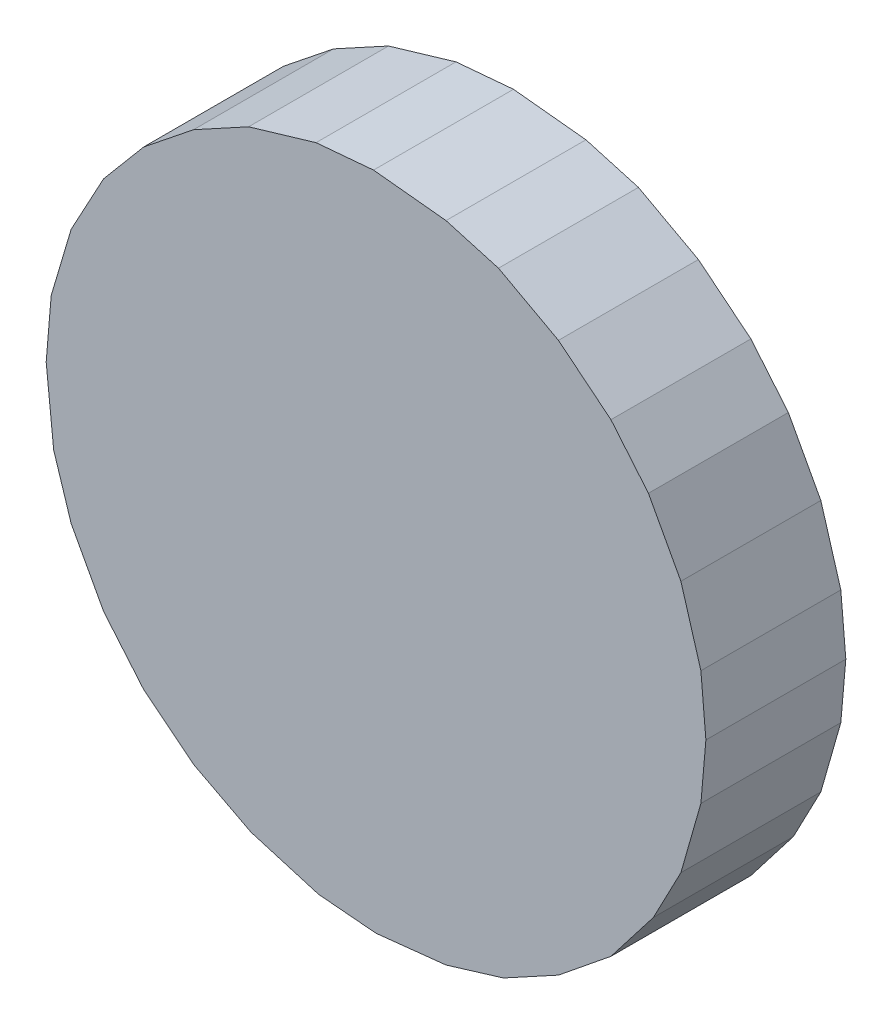
ISO-10303-21;
HEADER;
FILE_DESCRIPTION(('STEP AP214'),'2;1');
FILE_NAME('part.step','',(''),(''),'','','');
FILE_SCHEMA(('AUTOMOTIVE_DESIGN { 1 0 10303 214 1 1 1 1 }'));
ENDSEC;
DATA;
#1=APPLICATION_CONTEXT('core data for automotive mechanical design processes');
#2=APPLICATION_PROTOCOL_DEFINITION('international standard','automotive_design',2000,#1);
#3=PRODUCT_CONTEXT('',#1,'mechanical');
#4=PRODUCT('Part','Part','',(#3));
#5=PRODUCT_RELATED_PRODUCT_CATEGORY('part','',(#4));
#6=PRODUCT_DEFINITION_FORMATION('','',#4);
#7=PRODUCT_DEFINITION_CONTEXT('part definition',#1,'design');
#8=PRODUCT_DEFINITION('design','',#6,#7);
#9=PRODUCT_DEFINITION_SHAPE('','',#8);
#10=(LENGTH_UNIT() NAMED_UNIT(*) SI_UNIT(.MILLI.,.METRE.));
#11=(NAMED_UNIT(*) PLANE_ANGLE_UNIT() SI_UNIT($,.RADIAN.));
#12=(NAMED_UNIT(*) SI_UNIT($,.STERADIAN.) SOLID_ANGLE_UNIT());
#13=UNCERTAINTY_MEASURE_WITH_UNIT(LENGTH_MEASURE(1.E-05),#10,'distance_accuracy_value','');
#14=(GEOMETRIC_REPRESENTATION_CONTEXT(3) GLOBAL_UNCERTAINTY_ASSIGNED_CONTEXT((#13)) GLOBAL_UNIT_ASSIGNED_CONTEXT((#10,
#11,#12)) REPRESENTATION_CONTEXT('',''));
#15=CARTESIAN_POINT('',(0.,0.,0.));
#16=DIRECTION('',(0.,0.,1.));
#17=DIRECTION('',(1.,0.,0.));
#18=AXIS2_PLACEMENT_3D('',#15,#16,#17);
#19=CARTESIAN_POINT('',(-1.15,-6.499975,2.8));
#20=DIRECTION('',(0.0866296163648422,0.996240588195683,0.));
#21=DIRECTION('',(-0.996240588195683,0.0866296163648422,0.));
#22=AXIS2_PLACEMENT_3D('',#19,#20,#21);
#23=PLANE('',#22);
#24=DIRECTION('',(0.996240588195683,-0.0866296163648422,0.));
#25=VECTOR('',#24,1.);
#26=CARTESIAN_POINT('',(-1.15,-6.499975,0.));
#27=LINE('',#26,#25);
#28=CARTESIAN_POINT('',(-1.15,-6.499975,0.));
#29=VERTEX_POINT('',#28);
#30=CARTESIAN_POINT('',(0.,-6.599975,0.));
#31=VERTEX_POINT('',#30);
#32=EDGE_CURVE('E274',#29,#31,#27,.T.);
#33=ORIENTED_EDGE('',*,*,#32,.T.);
#34=DIRECTION('',(0.,0.,-1.));
#35=VECTOR('',#34,1.);
#36=CARTESIAN_POINT('',(0.,-6.599975,2.8));
#37=LINE('',#36,#35);
#38=CARTESIAN_POINT('',(0.,-6.599975,2.8));
#39=VERTEX_POINT('',#38);
#40=EDGE_CURVE('E11',#39,#31,#37,.T.);
#41=ORIENTED_EDGE('',*,*,#40,.F.);
#42=DIRECTION('',(0.996240588195683,-0.0866296163648422,0.));
#43=VECTOR('',#42,1.);
#44=CARTESIAN_POINT('',(-1.15,-6.499975,2.8));
#45=LINE('',#44,#43);
#46=CARTESIAN_POINT('',(-1.15,-6.499975,2.8));
#47=VERTEX_POINT('',#46);
#48=EDGE_CURVE('E336',#47,#39,#45,.T.);
#49=ORIENTED_EDGE('',*,*,#48,.F.);
#50=DIRECTION('',(0.,0.,-1.));
#51=VECTOR('',#50,1.);
#52=CARTESIAN_POINT('',(-1.15,-6.499975,2.8));
#53=LINE('',#52,#51);
#54=EDGE_CURVE('E270',#47,#29,#53,.T.);
#55=ORIENTED_EDGE('',*,*,#54,.T.);
#56=EDGE_LOOP('',(#33,#41,#49,#55));
#57=FACE_BOUND('',#56,.T.);
#58=ADVANCED_FACE('F34',(#57),#23,.F.);
#59=CARTESIAN_POINT('',(0.,-6.599975,2.8));
#60=DIRECTION('',(-0.106533123634265,0.994309153919809,0.));
#61=DIRECTION('',(-0.994309153919809,-0.106533123634265,0.));
#62=AXIS2_PLACEMENT_3D('',#59,#60,#61);
#63=PLANE('',#62);
#64=DIRECTION('',(0.994309153919809,0.106533123634265,0.));
#65=VECTOR('',#64,1.);
#66=CARTESIAN_POINT('',(0.,-6.599975,0.));
#67=LINE('',#66,#65);
#68=CARTESIAN_POINT('',(1.4,-6.449975,0.));
#69=VERTEX_POINT('',#68);
#70=EDGE_CURVE('E277',#31,#69,#67,.T.);
#71=ORIENTED_EDGE('',*,*,#70,.T.);
#72=DIRECTION('',(0.,0.,-1.));
#73=VECTOR('',#72,1.);
#74=CARTESIAN_POINT('',(1.4,-6.449975,2.8));
#75=LINE('',#74,#73);
#76=CARTESIAN_POINT('',(1.4,-6.449975,2.8));
#77=VERTEX_POINT('',#76);
#78=EDGE_CURVE('E42',#77,#69,#75,.T.);
#79=ORIENTED_EDGE('',*,*,#78,.F.);
#80=DIRECTION('',(0.994309153919809,0.106533123634265,0.));
#81=VECTOR('',#80,1.);
#82=CARTESIAN_POINT('',(0.,-6.599975,2.8));
#83=LINE('',#82,#81);
#84=EDGE_CURVE('E165',#39,#77,#83,.T.);
#85=ORIENTED_EDGE('',*,*,#84,.F.);
#86=ORIENTED_EDGE('',*,*,#40,.T.);
#87=EDGE_LOOP('',(#71,#79,#85,#86));
#88=FACE_BOUND('',#87,.T.);
#89=ADVANCED_FACE('F514',(#88),#63,.F.);
#90=CARTESIAN_POINT('',(1.4,-6.449975,2.8));
#91=DIRECTION('',(-0.291161615782697,0.956673880428858,0.));
#92=DIRECTION('',(-0.956673880428858,-0.291161615782697,0.));
#93=AXIS2_PLACEMENT_3D('',#90,#91,#92);
#94=PLANE('',#93);
#95=DIRECTION('',(0.956673880428858,0.291161615782696,0.));
#96=VECTOR('',#95,1.);
#97=CARTESIAN_POINT('',(1.4,-6.449975,0.));
#98=LINE('',#97,#96);
#99=CARTESIAN_POINT('',(2.55,-6.099975,0.));
#100=VERTEX_POINT('',#99);
#101=EDGE_CURVE('E279',#69,#100,#98,.T.);
#102=ORIENTED_EDGE('',*,*,#101,.T.);
#103=DIRECTION('',(0.,0.,-1.));
#104=VECTOR('',#103,1.);
#105=CARTESIAN_POINT('',(2.55,-6.099975,2.8));
#106=LINE('',#105,#104);
#107=CARTESIAN_POINT('',(2.55,-6.099975,2.8));
#108=VERTEX_POINT('',#107);
#109=EDGE_CURVE('E415',#108,#100,#106,.T.);
#110=ORIENTED_EDGE('',*,*,#109,.F.);
#111=DIRECTION('',(0.956673880428858,0.291161615782696,0.));
#112=VECTOR('',#111,1.);
#113=CARTESIAN_POINT('',(1.4,-6.449975,2.8));
#114=LINE('',#113,#112);
#115=EDGE_CURVE('E423',#77,#108,#114,.T.);
#116=ORIENTED_EDGE('',*,*,#115,.F.);
#117=ORIENTED_EDGE('',*,*,#78,.T.);
#118=EDGE_LOOP('',(#102,#110,#116,#117));
#119=FACE_BOUND('',#118,.T.);
#120=ADVANCED_FACE('F421',(#119),#94,.F.);
#121=CARTESIAN_POINT('',(2.55,-6.099975,2.8));
#122=DIRECTION('',(-0.478852130680573,0.877895572914385,0.));
#123=DIRECTION('',(-0.877895572914385,-0.478852130680573,0.));
#124=AXIS2_PLACEMENT_3D('',#121,#122,#123);
#125=PLANE('',#124);
#126=DIRECTION('',(0.877895572914384,0.478852130680573,0.));
#127=VECTOR('',#126,1.);
#128=CARTESIAN_POINT('',(2.55,-6.099975,0.));
#129=LINE('',#128,#127);
#130=CARTESIAN_POINT('',(3.65,-5.499975,0.));
#131=VERTEX_POINT('',#130);
#132=EDGE_CURVE('E281',#100,#131,#129,.T.);
#133=ORIENTED_EDGE('',*,*,#132,.T.);
#134=DIRECTION('',(0.,0.,-1.));
#135=VECTOR('',#134,1.);
#136=CARTESIAN_POINT('',(3.65,-5.499975,2.8));
#137=LINE('',#136,#135);
#138=CARTESIAN_POINT('',(3.65,-5.499975,2.8));
#139=VERTEX_POINT('',#138);
#140=EDGE_CURVE('E412',#139,#131,#137,.T.);
#141=ORIENTED_EDGE('',*,*,#140,.F.);
#142=DIRECTION('',(0.877895572914384,0.478852130680573,0.));
#143=VECTOR('',#142,1.);
#144=CARTESIAN_POINT('',(2.55,-6.099975,2.8));
#145=LINE('',#144,#143);
#146=EDGE_CURVE('E441',#108,#139,#145,.T.);
#147=ORIENTED_EDGE('',*,*,#146,.F.);
#148=ORIENTED_EDGE('',*,*,#109,.T.);
#149=EDGE_LOOP('',(#133,#141,#147,#148));
#150=FACE_BOUND('',#149,.T.);
#151=ADVANCED_FACE('F432',(#150),#125,.F.);
#152=CARTESIAN_POINT('',(3.65,-5.499975,2.8));
#153=DIRECTION('',(-0.629198228667964,0.777244870707486,0.));
#154=DIRECTION('',(-0.777244870707486,-0.629198228667964,0.));
#155=AXIS2_PLACEMENT_3D('',#152,#153,#154);
#156=PLANE('',#155);
#157=DIRECTION('',(0.777244870707486,0.629198228667964,0.));
#158=VECTOR('',#157,1.);
#159=CARTESIAN_POINT('',(3.65,-5.499975,0.));
#160=LINE('',#159,#158);
#161=CARTESIAN_POINT('',(4.7,-4.649975,0.));
#162=VERTEX_POINT('',#161);
#163=EDGE_CURVE('E283',#131,#162,#160,.T.);
#164=ORIENTED_EDGE('',*,*,#163,.T.);
#165=DIRECTION('',(0.,0.,-1.));
#166=VECTOR('',#165,1.);
#167=CARTESIAN_POINT('',(4.7,-4.649975,2.8));
#168=LINE('',#167,#166);
#169=CARTESIAN_POINT('',(4.7,-4.649975,2.8));
#170=VERTEX_POINT('',#169);
#171=EDGE_CURVE('E409',#170,#162,#168,.T.);
#172=ORIENTED_EDGE('',*,*,#171,.F.);
#173=DIRECTION('',(0.777244870707486,0.629198228667964,0.));
#174=VECTOR('',#173,1.);
#175=CARTESIAN_POINT('',(3.65,-5.499975,2.8));
#176=LINE('',#175,#174);
#177=EDGE_CURVE('E438',#139,#170,#176,.T.);
#178=ORIENTED_EDGE('',*,*,#177,.F.);
#179=ORIENTED_EDGE('',*,*,#140,.T.);
#180=EDGE_LOOP('',(#164,#172,#178,#179));
#181=FACE_BOUND('',#180,.T.);
#182=ADVANCED_FACE('F436',(#181),#156,.F.);
#183=CARTESIAN_POINT('',(4.7,-4.649975,2.8));
#184=DIRECTION('',(-0.791285001392167,0.611447501075765,0.));
#185=DIRECTION('',(-0.611447501075765,-0.791285001392167,0.));
#186=AXIS2_PLACEMENT_3D('',#183,#184,#185);
#187=PLANE('',#186);
#188=DIRECTION('',(0.611447501075765,0.791285001392167,0.));
#189=VECTOR('',#188,1.);
#190=CARTESIAN_POINT('',(4.7,-4.649975,0.));
#191=LINE('',#190,#189);
#192=CARTESIAN_POINT('',(5.55,-3.549975,0.));
#193=VERTEX_POINT('',#192);
#194=EDGE_CURVE('E285',#162,#193,#191,.T.);
#195=ORIENTED_EDGE('',*,*,#194,.T.);
#196=DIRECTION('',(0.,0.,-1.));
#197=VECTOR('',#196,1.);
#198=CARTESIAN_POINT('',(5.55,-3.549975,2.8));
#199=LINE('',#198,#197);
#200=CARTESIAN_POINT('',(5.55,-3.549975,2.8));
#201=VERTEX_POINT('',#200);
#202=EDGE_CURVE('E406',#201,#193,#199,.T.);
#203=ORIENTED_EDGE('',*,*,#202,.F.);
#204=DIRECTION('',(0.611447501075765,0.791285001392167,0.));
#205=VECTOR('',#204,1.);
#206=CARTESIAN_POINT('',(4.7,-4.649975,2.8));
#207=LINE('',#206,#205);
#208=EDGE_CURVE('E440',#170,#201,#207,.T.);
#209=ORIENTED_EDGE('',*,*,#208,.F.);
#210=ORIENTED_EDGE('',*,*,#171,.T.);
#211=EDGE_LOOP('',(#195,#203,#209,#210));
#212=FACE_BOUND('',#211,.T.);
#213=ADVANCED_FACE('F527',(#212),#187,.F.);
#214=CARTESIAN_POINT('',(5.55,-3.549975,2.8));
#215=DIRECTION('',(-0.885831535280156,0.464006994670557,0.));
#216=DIRECTION('',(-0.464006994670557,-0.885831535280156,0.));
#217=AXIS2_PLACEMENT_3D('',#214,#215,#216);
#218=PLANE('',#217);
#219=DIRECTION('',(0.464006994670557,0.885831535280156,0.));
#220=VECTOR('',#219,1.);
#221=CARTESIAN_POINT('',(5.55,-3.549975,0.));
#222=LINE('',#221,#220);
#223=CARTESIAN_POINT('',(6.1,-2.499975,0.));
#224=VERTEX_POINT('',#223);
#225=EDGE_CURVE('E287',#193,#224,#222,.T.);
#226=ORIENTED_EDGE('',*,*,#225,.T.);
#227=DIRECTION('',(0.,0.,-1.));
#228=VECTOR('',#227,1.);
#229=CARTESIAN_POINT('',(6.1,-2.499975,2.8));
#230=LINE('',#229,#228);
#231=CARTESIAN_POINT('',(6.1,-2.499975,2.8));
#232=VERTEX_POINT('',#231);
#233=EDGE_CURVE('E403',#232,#224,#230,.T.);
#234=ORIENTED_EDGE('',*,*,#233,.F.);
#235=DIRECTION('',(0.464006994670557,0.885831535280156,0.));
#236=VECTOR('',#235,1.);
#237=CARTESIAN_POINT('',(5.55,-3.549975,2.8));
#238=LINE('',#237,#236);
#239=EDGE_CURVE('E443',#201,#232,#238,.T.);
#240=ORIENTED_EDGE('',*,*,#239,.F.);
#241=ORIENTED_EDGE('',*,*,#202,.T.);
#242=EDGE_LOOP('',(#226,#234,#240,#241));
#243=FACE_BOUND('',#242,.T.);
#244=ADVANCED_FACE('F530',(#243),#218,.F.);
#245=CARTESIAN_POINT('',(6.1,-2.499975,2.8));
#246=DIRECTION('',(-0.961523947640823,0.274721127897378,0.));
#247=DIRECTION('',(-0.274721127897378,-0.961523947640823,0.));
#248=AXIS2_PLACEMENT_3D('',#245,#246,#247);
#249=PLANE('',#248);
#250=DIRECTION('',(0.274721127897378,0.961523947640823,0.));
#251=VECTOR('',#250,1.);
#252=CARTESIAN_POINT('',(6.1,-2.499975,0.));
#253=LINE('',#252,#251);
#254=CARTESIAN_POINT('',(6.5,-1.099975,0.));
#255=VERTEX_POINT('',#254);
#256=EDGE_CURVE('E289',#224,#255,#253,.T.);
#257=ORIENTED_EDGE('',*,*,#256,.T.);
#258=DIRECTION('',(0.,0.,-1.));
#259=VECTOR('',#258,1.);
#260=CARTESIAN_POINT('',(6.5,-1.099975,2.8));
#261=LINE('',#260,#259);
#262=CARTESIAN_POINT('',(6.5,-1.099975,2.8));
#263=VERTEX_POINT('',#262);
#264=EDGE_CURVE('E400',#263,#255,#261,.T.);
#265=ORIENTED_EDGE('',*,*,#264,.F.);
#266=DIRECTION('',(0.274721127897378,0.961523947640823,0.));
#267=VECTOR('',#266,1.);
#268=CARTESIAN_POINT('',(6.1,-2.499975,2.8));
#269=LINE('',#268,#267);
#270=EDGE_CURVE('E449',#232,#263,#269,.T.);
#271=ORIENTED_EDGE('',*,*,#270,.F.);
#272=ORIENTED_EDGE('',*,*,#233,.T.);
#273=EDGE_LOOP('',(#257,#265,#271,#272));
#274=FACE_BOUND('',#273,.T.);
#275=ADVANCED_FACE('F534',(#274),#249,.F.);
#276=CARTESIAN_POINT('',(6.5,-1.099975,2.8));
#277=DIRECTION('',(-0.996240588195683,0.0866296163648422,0.));
#278=DIRECTION('',(-0.0866296163648422,-0.996240588195683,0.));
#279=AXIS2_PLACEMENT_3D('',#276,#277,#278);
#280=PLANE('',#279);
#281=DIRECTION('',(0.0866296163648422,0.996240588195683,0.));
#282=VECTOR('',#281,1.);
#283=CARTESIAN_POINT('',(6.5,-1.099975,0.));
#284=LINE('',#283,#282);
#285=CARTESIAN_POINT('',(6.6,0.050025,0.));
#286=VERTEX_POINT('',#285);
#287=EDGE_CURVE('E291',#255,#286,#284,.T.);
#288=ORIENTED_EDGE('',*,*,#287,.T.);
#289=DIRECTION('',(0.,0.,-1.));
#290=VECTOR('',#289,1.);
#291=CARTESIAN_POINT('',(6.6,0.050025,2.8));
#292=LINE('',#291,#290);
#293=CARTESIAN_POINT('',(6.6,0.050025,2.8));
#294=VERTEX_POINT('',#293);
#295=EDGE_CURVE('E397',#294,#286,#292,.T.);
#296=ORIENTED_EDGE('',*,*,#295,.F.);
#297=DIRECTION('',(0.0866296163648422,0.996240588195683,0.));
#298=VECTOR('',#297,1.);
#299=CARTESIAN_POINT('',(6.5,-1.099975,2.8));
#300=LINE('',#299,#298);
#301=EDGE_CURVE('E451',#263,#294,#300,.T.);
#302=ORIENTED_EDGE('',*,*,#301,.F.);
#303=ORIENTED_EDGE('',*,*,#264,.T.);
#304=EDGE_LOOP('',(#288,#296,#302,#303));
#305=FACE_BOUND('',#304,.T.);
#306=ADVANCED_FACE('F538',(#305),#280,.F.);
#307=CARTESIAN_POINT('',(6.6,0.050025,2.8));
#308=DIRECTION('',(-0.996240588195683,-0.0866296163648422,0.));
#309=DIRECTION('',(0.0866296163648422,-0.996240588195683,0.));
#310=AXIS2_PLACEMENT_3D('',#307,#308,#309);
#311=PLANE('',#310);
#312=DIRECTION('',(-0.0866296163648422,0.996240588195683,0.));
#313=VECTOR('',#312,1.);
#314=CARTESIAN_POINT('',(6.6,0.050025,0.));
#315=LINE('',#314,#313);
#316=CARTESIAN_POINT('',(6.5,1.200025,0.));
#317=VERTEX_POINT('',#316);
#318=EDGE_CURVE('E293',#286,#317,#315,.T.);
#319=ORIENTED_EDGE('',*,*,#318,.T.);
#320=DIRECTION('',(0.,0.,-1.));
#321=VECTOR('',#320,1.);
#322=CARTESIAN_POINT('',(6.5,1.200025,2.8));
#323=LINE('',#322,#321);
#324=CARTESIAN_POINT('',(6.5,1.200025,2.8));
#325=VERTEX_POINT('',#324);
#326=EDGE_CURVE('E394',#325,#317,#323,.T.);
#327=ORIENTED_EDGE('',*,*,#326,.F.);
#328=DIRECTION('',(-0.0866296163648422,0.996240588195683,0.));
#329=VECTOR('',#328,1.);
#330=CARTESIAN_POINT('',(6.6,0.050025,2.8));
#331=LINE('',#330,#329);
#332=EDGE_CURVE('E453',#294,#325,#331,.T.);
#333=ORIENTED_EDGE('',*,*,#332,.F.);
#334=ORIENTED_EDGE('',*,*,#295,.T.);
#335=EDGE_LOOP('',(#319,#327,#333,#334));
#336=FACE_BOUND('',#335,.T.);
#337=ADVANCED_FACE('F542',(#336),#311,.F.);
#338=CARTESIAN_POINT('',(6.5,1.200025,2.8));
#339=DIRECTION('',(-0.958798112708387,-0.284088329691374,0.));
#340=DIRECTION('',(0.284088329691374,-0.958798112708387,0.));
#341=AXIS2_PLACEMENT_3D('',#338,#339,#340);
#342=PLANE('',#341);
#343=DIRECTION('',(-0.284088329691374,0.958798112708387,0.));
#344=VECTOR('',#343,1.);
#345=CARTESIAN_POINT('',(6.5,1.200025,0.));
#346=LINE('',#345,#344);
#347=CARTESIAN_POINT('',(6.1,2.550025,0.));
#348=VERTEX_POINT('',#347);
#349=EDGE_CURVE('E295',#317,#348,#346,.T.);
#350=ORIENTED_EDGE('',*,*,#349,.T.);
#351=DIRECTION('',(0.,0.,-1.));
#352=VECTOR('',#351,1.);
#353=CARTESIAN_POINT('',(6.1,2.550025,2.8));
#354=LINE('',#353,#352);
#355=CARTESIAN_POINT('',(6.1,2.550025,2.8));
#356=VERTEX_POINT('',#355);
#357=EDGE_CURVE('E391',#356,#348,#354,.T.);
#358=ORIENTED_EDGE('',*,*,#357,.F.);
#359=DIRECTION('',(-0.284088329691374,0.958798112708387,0.));
#360=VECTOR('',#359,1.);
#361=CARTESIAN_POINT('',(6.5,1.200025,2.8));
#362=LINE('',#361,#360);
#363=EDGE_CURVE('E455',#325,#356,#362,.T.);
#364=ORIENTED_EDGE('',*,*,#363,.F.);
#365=ORIENTED_EDGE('',*,*,#326,.T.);
#366=EDGE_LOOP('',(#350,#358,#364,#365));
#367=FACE_BOUND('',#366,.T.);
#368=ADVANCED_FACE('F546',(#367),#342,.F.);
#369=CARTESIAN_POINT('',(6.1,2.550025,2.8));
#370=DIRECTION('',(-0.879291966536774,-0.476283148540752,0.));
#371=DIRECTION('',(0.476283148540752,-0.879291966536774,0.));
#372=AXIS2_PLACEMENT_3D('',#369,#370,#371);
#373=PLANE('',#372);
#374=DIRECTION('',(-0.476283148540752,0.879291966536774,0.));
#375=VECTOR('',#374,1.);
#376=CARTESIAN_POINT('',(6.1,2.550025,0.));
#377=LINE('',#376,#375);
#378=CARTESIAN_POINT('',(5.45,3.750025,0.));
#379=VERTEX_POINT('',#378);
#380=EDGE_CURVE('E297',#348,#379,#377,.T.);
#381=ORIENTED_EDGE('',*,*,#380,.T.);
#382=DIRECTION('',(0.,0.,-1.));
#383=VECTOR('',#382,1.);
#384=CARTESIAN_POINT('',(5.45,3.750025,2.8));
#385=LINE('',#384,#383);
#386=CARTESIAN_POINT('',(5.45,3.750025,2.8));
#387=VERTEX_POINT('',#386);
#388=EDGE_CURVE('E388',#387,#379,#385,.T.);
#389=ORIENTED_EDGE('',*,*,#388,.F.);
#390=DIRECTION('',(-0.476283148540752,0.879291966536774,0.));
#391=VECTOR('',#390,1.);
#392=CARTESIAN_POINT('',(6.1,2.550025,2.8));
#393=LINE('',#392,#391);
#394=EDGE_CURVE('E457',#356,#387,#393,.T.);
#395=ORIENTED_EDGE('',*,*,#394,.F.);
#396=ORIENTED_EDGE('',*,*,#357,.T.);
#397=EDGE_LOOP('',(#381,#389,#395,#396));
#398=FACE_BOUND('',#397,.T.);
#399=ADVANCED_FACE('F550',(#398),#373,.F.);
#400=CARTESIAN_POINT('',(5.45,3.750025,2.8));
#401=DIRECTION('',(-0.768221279597376,-0.64018439966448,0.));
#402=DIRECTION('',(0.64018439966448,-0.768221279597376,0.));
#403=AXIS2_PLACEMENT_3D('',#400,#401,#402);
#404=PLANE('',#403);
#405=DIRECTION('',(-0.64018439966448,0.768221279597376,0.));
#406=VECTOR('',#405,1.);
#407=CARTESIAN_POINT('',(5.45,3.750025,0.));
#408=LINE('',#407,#406);
#409=CARTESIAN_POINT('',(4.7,4.650025,0.));
#410=VERTEX_POINT('',#409);
#411=EDGE_CURVE('E299',#379,#410,#408,.T.);
#412=ORIENTED_EDGE('',*,*,#411,.T.);
#413=DIRECTION('',(0.,0.,-1.));
#414=VECTOR('',#413,1.);
#415=CARTESIAN_POINT('',(4.7,4.650025,2.8));
#416=LINE('',#415,#414);
#417=CARTESIAN_POINT('',(4.7,4.650025,2.8));
#418=VERTEX_POINT('',#417);
#419=EDGE_CURVE('E385',#418,#410,#416,.T.);
#420=ORIENTED_EDGE('',*,*,#419,.F.);
#421=DIRECTION('',(-0.64018439966448,0.768221279597376,0.));
#422=VECTOR('',#421,1.);
#423=CARTESIAN_POINT('',(5.45,3.750025,2.8));
#424=LINE('',#423,#422);
#425=EDGE_CURVE('E459',#387,#418,#424,.T.);
#426=ORIENTED_EDGE('',*,*,#425,.F.);
#427=ORIENTED_EDGE('',*,*,#388,.T.);
#428=EDGE_LOOP('',(#412,#420,#426,#427));
#429=FACE_BOUND('',#428,.T.);
#430=ADVANCED_FACE('F554',(#429),#404,.F.);
#431=CARTESIAN_POINT('',(4.7,4.650025,2.8));
#432=DIRECTION('',(-0.629198228667964,-0.777244870707486,0.));
#433=DIRECTION('',(0.777244870707486,-0.629198228667964,0.));
#434=AXIS2_PLACEMENT_3D('',#431,#432,#433);
#435=PLANE('',#434);
#436=DIRECTION('',(-0.777244870707486,0.629198228667964,0.));
#437=VECTOR('',#436,1.);
#438=CARTESIAN_POINT('',(4.7,4.650025,0.));
#439=LINE('',#438,#437);
#440=CARTESIAN_POINT('',(3.65,5.500025,0.));
#441=VERTEX_POINT('',#440);
#442=EDGE_CURVE('E301',#410,#441,#439,.T.);
#443=ORIENTED_EDGE('',*,*,#442,.T.);
#444=DIRECTION('',(0.,0.,-1.));
#445=VECTOR('',#444,1.);
#446=CARTESIAN_POINT('',(3.65,5.500025,2.8));
#447=LINE('',#446,#445);
#448=CARTESIAN_POINT('',(3.65,5.500025,2.8));
#449=VERTEX_POINT('',#448);
#450=EDGE_CURVE('E382',#449,#441,#447,.T.);
#451=ORIENTED_EDGE('',*,*,#450,.F.);
#452=DIRECTION('',(-0.777244870707486,0.629198228667964,0.));
#453=VECTOR('',#452,1.);
#454=CARTESIAN_POINT('',(4.7,4.650025,2.8));
#455=LINE('',#454,#453);
#456=EDGE_CURVE('E461',#418,#449,#455,.T.);
#457=ORIENTED_EDGE('',*,*,#456,.F.);
#458=ORIENTED_EDGE('',*,*,#419,.T.);
#459=EDGE_LOOP('',(#443,#451,#457,#458));
#460=FACE_BOUND('',#459,.T.);
#461=ADVANCED_FACE('F558',(#460),#435,.F.);
#462=CARTESIAN_POINT('',(3.65,5.500025,2.8));
#463=DIRECTION('',(-0.476283148540753,-0.879291966536774,0.));
#464=DIRECTION('',(0.879291966536774,-0.476283148540753,0.));
#465=AXIS2_PLACEMENT_3D('',#462,#463,#464);
#466=PLANE('',#465);
#467=DIRECTION('',(-0.879291966536774,0.476283148540753,0.));
#468=VECTOR('',#467,1.);
#469=CARTESIAN_POINT('',(3.65,5.500025,0.));
#470=LINE('',#469,#468);
#471=CARTESIAN_POINT('',(2.45,6.150025,0.));
#472=VERTEX_POINT('',#471);
#473=EDGE_CURVE('E303',#441,#472,#470,.T.);
#474=ORIENTED_EDGE('',*,*,#473,.T.);
#475=DIRECTION('',(0.,0.,-1.));
#476=VECTOR('',#475,1.);
#477=CARTESIAN_POINT('',(2.45,6.150025,2.8));
#478=LINE('',#477,#476);
#479=CARTESIAN_POINT('',(2.45,6.150025,2.8));
#480=VERTEX_POINT('',#479);
#481=EDGE_CURVE('E379',#480,#472,#478,.T.);
#482=ORIENTED_EDGE('',*,*,#481,.F.);
#483=DIRECTION('',(-0.879291966536774,0.476283148540753,0.));
#484=VECTOR('',#483,1.);
#485=CARTESIAN_POINT('',(3.65,5.500025,2.8));
#486=LINE('',#485,#484);
#487=EDGE_CURVE('E463',#449,#480,#486,.T.);
#488=ORIENTED_EDGE('',*,*,#487,.F.);
#489=ORIENTED_EDGE('',*,*,#450,.T.);
#490=EDGE_LOOP('',(#474,#482,#488,#489));
#491=FACE_BOUND('',#490,.T.);
#492=ADVANCED_FACE('F562',(#491),#466,.F.);
#493=CARTESIAN_POINT('',(2.45,6.150025,2.8));
#494=DIRECTION('',(-0.274721127897378,-0.961523947640823,0.));
#495=DIRECTION('',(0.961523947640823,-0.274721127897378,0.));
#496=AXIS2_PLACEMENT_3D('',#493,#494,#495);
#497=PLANE('',#496);
#498=DIRECTION('',(-0.961523947640823,0.274721127897378,0.));
#499=VECTOR('',#498,1.);
#500=CARTESIAN_POINT('',(2.45,6.150025,0.));
#501=LINE('',#500,#499);
#502=CARTESIAN_POINT('',(1.4,6.450025,0.));
#503=VERTEX_POINT('',#502);
#504=EDGE_CURVE('E305',#472,#503,#501,.T.);
#505=ORIENTED_EDGE('',*,*,#504,.T.);
#506=DIRECTION('',(0.,0.,-1.));
#507=VECTOR('',#506,1.);
#508=CARTESIAN_POINT('',(1.4,6.450025,2.8));
#509=LINE('',#508,#507);
#510=CARTESIAN_POINT('',(1.4,6.450025,2.8));
#511=VERTEX_POINT('',#510);
#512=EDGE_CURVE('E376',#511,#503,#509,.T.);
#513=ORIENTED_EDGE('',*,*,#512,.F.);
#514=DIRECTION('',(-0.961523947640823,0.274721127897378,0.));
#515=VECTOR('',#514,1.);
#516=CARTESIAN_POINT('',(2.45,6.150025,2.8));
#517=LINE('',#516,#515);
#518=EDGE_CURVE('E465',#480,#511,#517,.T.);
#519=ORIENTED_EDGE('',*,*,#518,.F.);
#520=ORIENTED_EDGE('',*,*,#481,.T.);
#521=EDGE_LOOP('',(#505,#513,#519,#520));
#522=FACE_BOUND('',#521,.T.);
#523=ADVANCED_FACE('F566',(#522),#497,.F.);
#524=CARTESIAN_POINT('',(1.4,6.450025,2.8));
#525=DIRECTION('',(-0.102899151085505,-0.994691793826551,0.));
#526=DIRECTION('',(0.994691793826551,-0.102899151085505,0.));
#527=AXIS2_PLACEMENT_3D('',#524,#525,#526);
#528=PLANE('',#527);
#529=DIRECTION('',(-0.994691793826551,0.102899151085505,0.));
#530=VECTOR('',#529,1.);
#531=CARTESIAN_POINT('',(1.4,6.450025,0.));
#532=LINE('',#531,#530);
#533=CARTESIAN_POINT('',(-0.05,6.600025,0.));
#534=VERTEX_POINT('',#533);
#535=EDGE_CURVE('E307',#503,#534,#532,.T.);
#536=ORIENTED_EDGE('',*,*,#535,.T.);
#537=DIRECTION('',(0.,0.,-1.));
#538=VECTOR('',#537,1.);
#539=CARTESIAN_POINT('',(-0.05,6.600025,2.8));
#540=LINE('',#539,#538);
#541=CARTESIAN_POINT('',(-0.05,6.600025,2.8));
#542=VERTEX_POINT('',#541);
#543=EDGE_CURVE('E373',#542,#534,#540,.T.);
#544=ORIENTED_EDGE('',*,*,#543,.F.);
#545=DIRECTION('',(-0.994691793826551,0.102899151085505,0.));
#546=VECTOR('',#545,1.);
#547=CARTESIAN_POINT('',(1.4,6.450025,2.8));
#548=LINE('',#547,#546);
#549=EDGE_CURVE('E467',#511,#542,#548,.T.);
#550=ORIENTED_EDGE('',*,*,#549,.F.);
#551=ORIENTED_EDGE('',*,*,#512,.T.);
#552=EDGE_LOOP('',(#536,#544,#550,#551));
#553=FACE_BOUND('',#552,.T.);
#554=ADVANCED_FACE('F570',(#553),#528,.F.);
#555=CARTESIAN_POINT('',(-0.05,6.600025,2.8));
#556=DIRECTION('',(0.0866296163648422,-0.996240588195683,0.));
#557=DIRECTION('',(0.996240588195683,0.0866296163648422,0.));
#558=AXIS2_PLACEMENT_3D('',#555,#556,#557);
#559=PLANE('',#558);
#560=DIRECTION('',(-0.996240588195683,-0.0866296163648422,0.));
#561=VECTOR('',#560,1.);
#562=CARTESIAN_POINT('',(-0.05,6.600025,0.));
#563=LINE('',#562,#561);
#564=CARTESIAN_POINT('',(-1.2,6.500025,0.));
#565=VERTEX_POINT('',#564);
#566=EDGE_CURVE('E309',#534,#565,#563,.T.);
#567=ORIENTED_EDGE('',*,*,#566,.T.);
#568=DIRECTION('',(0.,0.,-1.));
#569=VECTOR('',#568,1.);
#570=CARTESIAN_POINT('',(-1.2,6.500025,2.8));
#571=LINE('',#570,#569);
#572=CARTESIAN_POINT('',(-1.2,6.500025,2.8));
#573=VERTEX_POINT('',#572);
#574=EDGE_CURVE('E370',#573,#565,#571,.T.);
#575=ORIENTED_EDGE('',*,*,#574,.F.);
#576=DIRECTION('',(-0.996240588195683,-0.0866296163648422,0.));
#577=VECTOR('',#576,1.);
#578=CARTESIAN_POINT('',(-0.05,6.600025,2.8));
#579=LINE('',#578,#577);
#580=EDGE_CURVE('E469',#542,#573,#579,.T.);
#581=ORIENTED_EDGE('',*,*,#580,.F.);
#582=ORIENTED_EDGE('',*,*,#543,.T.);
#583=EDGE_LOOP('',(#567,#575,#581,#582));
#584=FACE_BOUND('',#583,.T.);
#585=ADVANCED_FACE('F574',(#584),#559,.F.);
#586=CARTESIAN_POINT('',(-1.2,6.500025,2.8));
#587=DIRECTION('',(0.284088329691374,-0.958798112708387,0.));
#588=DIRECTION('',(0.958798112708387,0.284088329691374,0.));
#589=AXIS2_PLACEMENT_3D('',#586,#587,#588);
#590=PLANE('',#589);
#591=DIRECTION('',(-0.958798112708387,-0.284088329691374,0.));
#592=VECTOR('',#591,1.);
#593=CARTESIAN_POINT('',(-1.2,6.500025,0.));
#594=LINE('',#593,#592);
#595=CARTESIAN_POINT('',(-2.55,6.100025,0.));
#596=VERTEX_POINT('',#595);
#597=EDGE_CURVE('E311',#565,#596,#594,.T.);
#598=ORIENTED_EDGE('',*,*,#597,.T.);
#599=DIRECTION('',(0.,0.,-1.));
#600=VECTOR('',#599,1.);
#601=CARTESIAN_POINT('',(-2.55,6.100025,2.8));
#602=LINE('',#601,#600);
#603=CARTESIAN_POINT('',(-2.55,6.100025,2.8));
#604=VERTEX_POINT('',#603);
#605=EDGE_CURVE('E367',#604,#596,#602,.T.);
#606=ORIENTED_EDGE('',*,*,#605,.F.);
#607=DIRECTION('',(-0.958798112708387,-0.284088329691374,0.));
#608=VECTOR('',#607,1.);
#609=CARTESIAN_POINT('',(-1.2,6.500025,2.8));
#610=LINE('',#609,#608);
#611=EDGE_CURVE('E471',#573,#604,#610,.T.);
#612=ORIENTED_EDGE('',*,*,#611,.F.);
#613=ORIENTED_EDGE('',*,*,#574,.T.);
#614=EDGE_LOOP('',(#598,#606,#612,#613));
#615=FACE_BOUND('',#614,.T.);
#616=ADVANCED_FACE('F578',(#615),#590,.F.);
#617=CARTESIAN_POINT('',(-2.55,6.100025,2.8));
#618=DIRECTION('',(0.478852130680573,-0.877895572914385,0.));
#619=DIRECTION('',(0.877895572914385,0.478852130680573,0.));
#620=AXIS2_PLACEMENT_3D('',#617,#618,#619);
#621=PLANE('',#620);
#622=DIRECTION('',(-0.877895572914384,-0.478852130680573,0.));
#623=VECTOR('',#622,1.);
#624=CARTESIAN_POINT('',(-2.55,6.100025,0.));
#625=LINE('',#624,#623);
#626=CARTESIAN_POINT('',(-3.65,5.500025,0.));
#627=VERTEX_POINT('',#626);
#628=EDGE_CURVE('E313',#596,#627,#625,.T.);
#629=ORIENTED_EDGE('',*,*,#628,.T.);
#630=DIRECTION('',(0.,0.,-1.));
#631=VECTOR('',#630,1.);
#632=CARTESIAN_POINT('',(-3.65,5.500025,2.8));
#633=LINE('',#632,#631);
#634=CARTESIAN_POINT('',(-3.65,5.500025,2.8));
#635=VERTEX_POINT('',#634);
#636=EDGE_CURVE('E364',#635,#627,#633,.T.);
#637=ORIENTED_EDGE('',*,*,#636,.F.);
#638=DIRECTION('',(-0.877895572914384,-0.478852130680573,0.));
#639=VECTOR('',#638,1.);
#640=CARTESIAN_POINT('',(-2.55,6.100025,2.8));
#641=LINE('',#640,#639);
#642=EDGE_CURVE('E473',#604,#635,#641,.T.);
#643=ORIENTED_EDGE('',*,*,#642,.F.);
#644=ORIENTED_EDGE('',*,*,#605,.T.);
#645=EDGE_LOOP('',(#629,#637,#643,#644));
#646=FACE_BOUND('',#645,.T.);
#647=ADVANCED_FACE('F582',(#646),#621,.F.);
#648=CARTESIAN_POINT('',(-3.65,5.500025,2.8));
#649=DIRECTION('',(0.624695047554424,-0.780868809443031,0.));
#650=DIRECTION('',(0.780868809443031,0.624695047554424,0.));
#651=AXIS2_PLACEMENT_3D('',#648,#649,#650);
#652=PLANE('',#651);
#653=DIRECTION('',(-0.780868809443031,-0.624695047554424,0.));
#654=VECTOR('',#653,1.);
#655=CARTESIAN_POINT('',(-3.65,5.500025,0.));
#656=LINE('',#655,#654);
#657=CARTESIAN_POINT('',(-4.65,4.700025,0.));
#658=VERTEX_POINT('',#657);
#659=EDGE_CURVE('E315',#627,#658,#656,.T.);
#660=ORIENTED_EDGE('',*,*,#659,.T.);
#661=DIRECTION('',(0.,0.,-1.));
#662=VECTOR('',#661,1.);
#663=CARTESIAN_POINT('',(-4.65,4.700025,2.8));
#664=LINE('',#663,#662);
#665=CARTESIAN_POINT('',(-4.65,4.700025,2.8));
#666=VERTEX_POINT('',#665);
#667=EDGE_CURVE('E361',#666,#658,#664,.T.);
#668=ORIENTED_EDGE('',*,*,#667,.F.);
#669=DIRECTION('',(-0.780868809443031,-0.624695047554424,0.));
#670=VECTOR('',#669,1.);
#671=CARTESIAN_POINT('',(-3.65,5.500025,2.8));
#672=LINE('',#671,#670);
#673=EDGE_CURVE('E475',#635,#666,#672,.T.);
#674=ORIENTED_EDGE('',*,*,#673,.F.);
#675=ORIENTED_EDGE('',*,*,#636,.T.);
#676=EDGE_LOOP('',(#660,#668,#674,#675));
#677=FACE_BOUND('',#676,.T.);
#678=ADVANCED_FACE('F586',(#677),#652,.F.);
#679=CARTESIAN_POINT('',(-4.65,4.700025,2.8));
#680=DIRECTION('',(0.764911198117051,-0.644135745782779,0.));
#681=DIRECTION('',(0.64413574578278,0.764911198117051,0.));
#682=AXIS2_PLACEMENT_3D('',#679,#680,#681);
#683=PLANE('',#682);
#684=DIRECTION('',(-0.644135745782779,-0.764911198117051,0.));
#685=VECTOR('',#684,1.);
#686=CARTESIAN_POINT('',(-4.65,4.700025,0.));
#687=LINE('',#686,#685);
#688=CARTESIAN_POINT('',(-5.45,3.750025,0.));
#689=VERTEX_POINT('',#688);
#690=EDGE_CURVE('E317',#658,#689,#687,.T.);
#691=ORIENTED_EDGE('',*,*,#690,.T.);
#692=DIRECTION('',(0.,0.,-1.));
#693=VECTOR('',#692,1.);
#694=CARTESIAN_POINT('',(-5.45,3.750025,2.8));
#695=LINE('',#694,#693);
#696=CARTESIAN_POINT('',(-5.45,3.750025,2.8));
#697=VERTEX_POINT('',#696);
#698=EDGE_CURVE('E358',#697,#689,#695,.T.);
#699=ORIENTED_EDGE('',*,*,#698,.F.);
#700=DIRECTION('',(-0.644135745782779,-0.764911198117051,0.));
#701=VECTOR('',#700,1.);
#702=CARTESIAN_POINT('',(-4.65,4.700025,2.8));
#703=LINE('',#702,#701);
#704=EDGE_CURVE('E477',#666,#697,#703,.T.);
#705=ORIENTED_EDGE('',*,*,#704,.F.);
#706=ORIENTED_EDGE('',*,*,#667,.T.);
#707=EDGE_LOOP('',(#691,#699,#705,#706));
#708=FACE_BOUND('',#707,.T.);
#709=ADVANCED_FACE('F590',(#708),#683,.F.);
#710=CARTESIAN_POINT('',(-5.45,3.750025,2.8));
#711=DIRECTION('',(0.879291966536774,-0.476283148540752,0.));
#712=DIRECTION('',(0.476283148540752,0.879291966536774,0.));
#713=AXIS2_PLACEMENT_3D('',#710,#711,#712);
#714=PLANE('',#713);
#715=DIRECTION('',(-0.476283148540752,-0.879291966536774,0.));
#716=VECTOR('',#715,1.);
#717=CARTESIAN_POINT('',(-5.45,3.750025,0.));
#718=LINE('',#717,#716);
#719=CARTESIAN_POINT('',(-6.1,2.550025,0.));
#720=VERTEX_POINT('',#719);
#721=EDGE_CURVE('E319',#689,#720,#718,.T.);
#722=ORIENTED_EDGE('',*,*,#721,.T.);
#723=DIRECTION('',(0.,0.,-1.));
#724=VECTOR('',#723,1.);
#725=CARTESIAN_POINT('',(-6.1,2.550025,2.8));
#726=LINE('',#725,#724);
#727=CARTESIAN_POINT('',(-6.1,2.550025,2.8));
#728=VERTEX_POINT('',#727);
#729=EDGE_CURVE('E355',#728,#720,#726,.T.);
#730=ORIENTED_EDGE('',*,*,#729,.F.);
#731=DIRECTION('',(-0.476283148540752,-0.879291966536774,0.));
#732=VECTOR('',#731,1.);
#733=CARTESIAN_POINT('',(-5.45,3.750025,2.8));
#734=LINE('',#733,#732);
#735=EDGE_CURVE('E479',#697,#728,#734,.T.);
#736=ORIENTED_EDGE('',*,*,#735,.F.);
#737=ORIENTED_EDGE('',*,*,#698,.T.);
#738=EDGE_LOOP('',(#722,#730,#736,#737));
#739=FACE_BOUND('',#738,.T.);
#740=ADVANCED_FACE('F594',(#739),#714,.F.);
#741=CARTESIAN_POINT('',(-6.1,2.550025,2.8));
#742=DIRECTION('',(0.958798112708387,-0.284088329691374,0.));
#743=DIRECTION('',(0.284088329691374,0.958798112708387,0.));
#744=AXIS2_PLACEMENT_3D('',#741,#742,#743);
#745=PLANE('',#744);
#746=DIRECTION('',(-0.284088329691374,-0.958798112708387,0.));
#747=VECTOR('',#746,1.);
#748=CARTESIAN_POINT('',(-6.1,2.550025,0.));
#749=LINE('',#748,#747);
#750=CARTESIAN_POINT('',(-6.5,1.200025,0.));
#751=VERTEX_POINT('',#750);
#752=EDGE_CURVE('E321',#720,#751,#749,.T.);
#753=ORIENTED_EDGE('',*,*,#752,.T.);
#754=DIRECTION('',(0.,0.,-1.));
#755=VECTOR('',#754,1.);
#756=CARTESIAN_POINT('',(-6.5,1.200025,2.8));
#757=LINE('',#756,#755);
#758=CARTESIAN_POINT('',(-6.5,1.200025,2.8));
#759=VERTEX_POINT('',#758);
#760=EDGE_CURVE('E352',#759,#751,#757,.T.);
#761=ORIENTED_EDGE('',*,*,#760,.F.);
#762=DIRECTION('',(-0.284088329691374,-0.958798112708387,0.));
#763=VECTOR('',#762,1.);
#764=CARTESIAN_POINT('',(-6.1,2.550025,2.8));
#765=LINE('',#764,#763);
#766=EDGE_CURVE('E481',#728,#759,#765,.T.);
#767=ORIENTED_EDGE('',*,*,#766,.F.);
#768=ORIENTED_EDGE('',*,*,#729,.T.);
#769=EDGE_LOOP('',(#753,#761,#767,#768));
#770=FACE_BOUND('',#769,.T.);
#771=ADVANCED_FACE('F598',(#770),#745,.F.);
#772=CARTESIAN_POINT('',(-6.5,1.200025,2.8));
#773=DIRECTION('',(0.99654575824488,-0.0830454798537402,0.));
#774=DIRECTION('',(0.0830454798537402,0.99654575824488,0.));
#775=AXIS2_PLACEMENT_3D('',#772,#773,#774);
#776=PLANE('',#775);
#777=DIRECTION('',(-0.0830454798537402,-0.99654575824488,0.));
#778=VECTOR('',#777,1.);
#779=CARTESIAN_POINT('',(-6.5,1.200025,0.));
#780=LINE('',#779,#778);
#781=CARTESIAN_POINT('',(-6.6,2.5E-05,0.));
#782=VERTEX_POINT('',#781);
#783=EDGE_CURVE('E323',#751,#782,#780,.T.);
#784=ORIENTED_EDGE('',*,*,#783,.T.);
#785=DIRECTION('',(0.,0.,-1.));
#786=VECTOR('',#785,1.);
#787=CARTESIAN_POINT('',(-6.6,2.5E-05,2.8));
#788=LINE('',#787,#786);
#789=CARTESIAN_POINT('',(-6.6,2.5E-05,2.8));
#790=VERTEX_POINT('',#789);
#791=EDGE_CURVE('E349',#790,#782,#788,.T.);
#792=ORIENTED_EDGE('',*,*,#791,.F.);
#793=DIRECTION('',(-0.0830454798537402,-0.99654575824488,0.));
#794=VECTOR('',#793,1.);
#795=CARTESIAN_POINT('',(-6.5,1.200025,2.8));
#796=LINE('',#795,#794);
#797=EDGE_CURVE('E483',#759,#790,#796,.T.);
#798=ORIENTED_EDGE('',*,*,#797,.F.);
#799=ORIENTED_EDGE('',*,*,#760,.T.);
#800=EDGE_LOOP('',(#784,#792,#798,#799));
#801=FACE_BOUND('',#800,.T.);
#802=ADVANCED_FACE('F602',(#801),#776,.F.);
#803=CARTESIAN_POINT('',(-6.6,2.5E-05,2.8));
#804=DIRECTION('',(0.994691793826551,0.102899151085505,0.));
#805=DIRECTION('',(-0.102899151085505,0.994691793826551,0.));
#806=AXIS2_PLACEMENT_3D('',#803,#804,#805);
#807=PLANE('',#806);
#808=DIRECTION('',(0.102899151085505,-0.994691793826551,0.));
#809=VECTOR('',#808,1.);
#810=CARTESIAN_POINT('',(-6.6,2.5E-05,0.));
#811=LINE('',#810,#809);
#812=CARTESIAN_POINT('',(-6.45,-1.449975,0.));
#813=VERTEX_POINT('',#812);
#814=EDGE_CURVE('E325',#782,#813,#811,.T.);
#815=ORIENTED_EDGE('',*,*,#814,.T.);
#816=DIRECTION('',(0.,0.,-1.));
#817=VECTOR('',#816,1.);
#818=CARTESIAN_POINT('',(-6.45,-1.449975,2.8));
#819=LINE('',#818,#817);
#820=CARTESIAN_POINT('',(-6.45,-1.449975,2.8));
#821=VERTEX_POINT('',#820);
#822=EDGE_CURVE('E346',#821,#813,#819,.T.);
#823=ORIENTED_EDGE('',*,*,#822,.F.);
#824=DIRECTION('',(0.102899151085505,-0.994691793826551,0.));
#825=VECTOR('',#824,1.);
#826=CARTESIAN_POINT('',(-6.6,2.5E-05,2.8));
#827=LINE('',#826,#825);
#828=EDGE_CURVE('E485',#790,#821,#827,.T.);
#829=ORIENTED_EDGE('',*,*,#828,.F.);
#830=ORIENTED_EDGE('',*,*,#791,.T.);
#831=EDGE_LOOP('',(#815,#823,#829,#830));
#832=FACE_BOUND('',#831,.T.);
#833=ADVANCED_FACE('F606',(#832),#807,.F.);
#834=CARTESIAN_POINT('',(-6.45,-1.449975,2.8));
#835=DIRECTION('',(0.952925780013262,0.303203657276947,0.));
#836=DIRECTION('',(-0.303203657276947,0.952925780013262,0.));
#837=AXIS2_PLACEMENT_3D('',#834,#835,#836);
#838=PLANE('',#837);
#839=DIRECTION('',(0.303203657276947,-0.952925780013262,0.));
#840=VECTOR('',#839,1.);
#841=CARTESIAN_POINT('',(-6.45,-1.449975,0.));
#842=LINE('',#841,#840);
#843=CARTESIAN_POINT('',(-6.1,-2.549975,0.));
#844=VERTEX_POINT('',#843);
#845=EDGE_CURVE('E327',#813,#844,#842,.T.);
#846=ORIENTED_EDGE('',*,*,#845,.T.);
#847=DIRECTION('',(0.,0.,-1.));
#848=VECTOR('',#847,1.);
#849=CARTESIAN_POINT('',(-6.1,-2.549975,2.8));
#850=LINE('',#849,#848);
#851=CARTESIAN_POINT('',(-6.1,-2.549975,2.8));
#852=VERTEX_POINT('',#851);
#853=EDGE_CURVE('E343',#852,#844,#850,.T.);
#854=ORIENTED_EDGE('',*,*,#853,.F.);
#855=DIRECTION('',(0.303203657276947,-0.952925780013262,0.));
#856=VECTOR('',#855,1.);
#857=CARTESIAN_POINT('',(-6.45,-1.449975,2.8));
#858=LINE('',#857,#856);
#859=EDGE_CURVE('E487',#821,#852,#858,.T.);
#860=ORIENTED_EDGE('',*,*,#859,.F.);
#861=ORIENTED_EDGE('',*,*,#822,.T.);
#862=EDGE_LOOP('',(#846,#854,#860,#861));
#863=FACE_BOUND('',#862,.T.);
#864=ADVANCED_FACE('F610',(#863),#838,.F.);
#865=CARTESIAN_POINT('',(-6.1,-2.549975,2.8));
#866=DIRECTION('',(0.879291966536774,0.476283148540752,0.));
#867=DIRECTION('',(-0.476283148540752,0.879291966536774,0.));
#868=AXIS2_PLACEMENT_3D('',#865,#866,#867);
#869=PLANE('',#868);
#870=DIRECTION('',(0.476283148540752,-0.879291966536774,0.));
#871=VECTOR('',#870,1.);
#872=CARTESIAN_POINT('',(-6.1,-2.549975,0.));
#873=LINE('',#872,#871);
#874=CARTESIAN_POINT('',(-5.45,-3.749975,0.));
#875=VERTEX_POINT('',#874);
#876=EDGE_CURVE('E329',#844,#875,#873,.T.);
#877=ORIENTED_EDGE('',*,*,#876,.T.);
#878=DIRECTION('',(0.,0.,-1.));
#879=VECTOR('',#878,1.);
#880=CARTESIAN_POINT('',(-5.45,-3.749975,2.8));
#881=LINE('',#880,#879);
#882=CARTESIAN_POINT('',(-5.45,-3.749975,2.8));
#883=VERTEX_POINT('',#882);
#884=EDGE_CURVE('E340',#883,#875,#881,.T.);
#885=ORIENTED_EDGE('',*,*,#884,.F.);
#886=DIRECTION('',(0.476283148540752,-0.879291966536774,0.));
#887=VECTOR('',#886,1.);
#888=CARTESIAN_POINT('',(-6.1,-2.549975,2.8));
#889=LINE('',#888,#887);
#890=EDGE_CURVE('E489',#852,#883,#889,.T.);
#891=ORIENTED_EDGE('',*,*,#890,.F.);
#892=ORIENTED_EDGE('',*,*,#853,.T.);
#893=EDGE_LOOP('',(#877,#885,#891,#892));
#894=FACE_BOUND('',#893,.T.);
#895=ADVANCED_FACE('F495',(#894),#869,.F.);
#896=CARTESIAN_POINT('',(-5.45,-3.749975,2.8));
#897=DIRECTION('',(0.764911198117051,0.644135745782779,0.));
#898=DIRECTION('',(-0.644135745782779,0.764911198117051,0.));
#899=AXIS2_PLACEMENT_3D('',#896,#897,#898);
#900=PLANE('',#899);
#901=DIRECTION('',(0.644135745782779,-0.764911198117051,0.));
#902=VECTOR('',#901,1.);
#903=CARTESIAN_POINT('',(-5.45,-3.749975,0.));
#904=LINE('',#903,#902);
#905=CARTESIAN_POINT('',(-4.65,-4.699975,0.));
#906=VERTEX_POINT('',#905);
#907=EDGE_CURVE('E331',#875,#906,#904,.T.);
#908=ORIENTED_EDGE('',*,*,#907,.T.);
#909=DIRECTION('',(0.,0.,-1.));
#910=VECTOR('',#909,1.);
#911=CARTESIAN_POINT('',(-4.65,-4.699975,2.8));
#912=LINE('',#911,#910);
#913=CARTESIAN_POINT('',(-4.65,-4.699975,2.8));
#914=VERTEX_POINT('',#913);
#915=EDGE_CURVE('E265',#914,#906,#912,.T.);
#916=ORIENTED_EDGE('',*,*,#915,.F.);
#917=DIRECTION('',(0.644135745782779,-0.764911198117051,0.));
#918=VECTOR('',#917,1.);
#919=CARTESIAN_POINT('',(-5.45,-3.749975,2.8));
#920=LINE('',#919,#918);
#921=EDGE_CURVE('E256',#883,#914,#920,.T.);
#922=ORIENTED_EDGE('',*,*,#921,.F.);
#923=ORIENTED_EDGE('',*,*,#884,.T.);
#924=EDGE_LOOP('',(#908,#916,#922,#923));
#925=FACE_BOUND('',#924,.T.);
#926=ADVANCED_FACE('F499',(#925),#900,.F.);
#927=CARTESIAN_POINT('',(-4.65,-4.699975,2.8));
#928=DIRECTION('',(0.624695047554424,0.780868809443031,0.));
#929=DIRECTION('',(-0.780868809443031,0.624695047554424,0.));
#930=AXIS2_PLACEMENT_3D('',#927,#928,#929);
#931=PLANE('',#930);
#932=DIRECTION('',(0.780868809443031,-0.624695047554424,0.));
#933=VECTOR('',#932,1.);
#934=CARTESIAN_POINT('',(-4.65,-4.699975,0.));
#935=LINE('',#934,#933);
#936=CARTESIAN_POINT('',(-3.65,-5.499975,0.));
#937=VERTEX_POINT('',#936);
#938=EDGE_CURVE('E264',#906,#937,#935,.T.);
#939=ORIENTED_EDGE('',*,*,#938,.T.);
#940=DIRECTION('',(0.,0.,-1.));
#941=VECTOR('',#940,1.);
#942=CARTESIAN_POINT('',(-3.65,-5.499975,2.8));
#943=LINE('',#942,#941);
#944=CARTESIAN_POINT('',(-3.65,-5.499975,2.8));
#945=VERTEX_POINT('',#944);
#946=EDGE_CURVE('E261',#945,#937,#943,.T.);
#947=ORIENTED_EDGE('',*,*,#946,.F.);
#948=DIRECTION('',(0.780868809443031,-0.624695047554424,0.));
#949=VECTOR('',#948,1.);
#950=CARTESIAN_POINT('',(-4.65,-4.699975,2.8));
#951=LINE('',#950,#949);
#952=EDGE_CURVE('E250',#914,#945,#951,.T.);
#953=ORIENTED_EDGE('',*,*,#952,.F.);
#954=ORIENTED_EDGE('',*,*,#915,.T.);
#955=EDGE_LOOP('',(#939,#947,#953,#954));
#956=FACE_BOUND('',#955,.T.);
#957=ADVANCED_FACE('F262',(#956),#931,.F.);
#958=CARTESIAN_POINT('',(-3.65,-5.499975,2.8));
#959=DIRECTION('',(0.46256600669502,0.886584846165455,0.));
#960=DIRECTION('',(-0.886584846165455,0.46256600669502,0.));
#961=AXIS2_PLACEMENT_3D('',#958,#959,#960);
#962=PLANE('',#961);
#963=DIRECTION('',(0.886584846165455,-0.46256600669502,0.));
#964=VECTOR('',#963,1.);
#965=CARTESIAN_POINT('',(-3.65,-5.499975,0.));
#966=LINE('',#965,#964);
#967=CARTESIAN_POINT('',(-2.5,-6.099975,0.));
#968=VERTEX_POINT('',#967);
#969=EDGE_CURVE('E151',#937,#968,#966,.T.);
#970=ORIENTED_EDGE('',*,*,#969,.T.);
#971=DIRECTION('',(0.,0.,-1.));
#972=VECTOR('',#971,1.);
#973=CARTESIAN_POINT('',(-2.5,-6.099975,2.8));
#974=LINE('',#973,#972);
#975=CARTESIAN_POINT('',(-2.5,-6.099975,2.8));
#976=VERTEX_POINT('',#975);
#977=EDGE_CURVE('E266',#976,#968,#974,.T.);
#978=ORIENTED_EDGE('',*,*,#977,.F.);
#979=DIRECTION('',(0.886584846165455,-0.46256600669502,0.));
#980=VECTOR('',#979,1.);
#981=CARTESIAN_POINT('',(-3.65,-5.499975,2.8));
#982=LINE('',#981,#980);
#983=EDGE_CURVE('E254',#945,#976,#982,.T.);
#984=ORIENTED_EDGE('',*,*,#983,.F.);
#985=ORIENTED_EDGE('',*,*,#946,.T.);
#986=EDGE_LOOP('',(#970,#978,#984,#985));
#987=FACE_BOUND('',#986,.T.);
#988=ADVANCED_FACE('F268',(#987),#962,.F.);
#989=CARTESIAN_POINT('',(-2.5,-6.099975,2.8));
#990=DIRECTION('',(0.284088329691374,0.958798112708387,0.));
#991=DIRECTION('',(-0.958798112708387,0.284088329691374,0.));
#992=AXIS2_PLACEMENT_3D('',#989,#990,#991);
#993=PLANE('',#992);
#994=DIRECTION('',(0.958798112708387,-0.284088329691374,0.));
#995=VECTOR('',#994,1.);
#996=CARTESIAN_POINT('',(-2.5,-6.099975,0.));
#997=LINE('',#996,#995);
#998=EDGE_CURVE('E157',#968,#29,#997,.T.);
#999=ORIENTED_EDGE('',*,*,#998,.T.);
#1000=ORIENTED_EDGE('',*,*,#54,.F.);
#1001=DIRECTION('',(0.958798112708387,-0.284088329691374,0.));
#1002=VECTOR('',#1001,1.);
#1003=CARTESIAN_POINT('',(-2.5,-6.099975,2.8));
#1004=LINE('',#1003,#1002);
#1005=EDGE_CURVE('E50',#976,#47,#1004,.T.);
#1006=ORIENTED_EDGE('',*,*,#1005,.F.);
#1007=ORIENTED_EDGE('',*,*,#977,.T.);
#1008=EDGE_LOOP('',(#999,#1000,#1006,#1007));
#1009=FACE_BOUND('',#1008,.T.);
#1010=ADVANCED_FACE('F503',(#1009),#993,.F.);
#1011=CARTESIAN_POINT('',(0.,0.,2.8));
#1012=DIRECTION('',(0.,0.,1.));
#1013=DIRECTION('',(1.,0.,0.));
#1014=AXIS2_PLACEMENT_3D('',#1011,#1012,#1013);
#1015=PLANE('',#1014);
#1016=ORIENTED_EDGE('',*,*,#48,.T.);
#1017=ORIENTED_EDGE('',*,*,#84,.T.);
#1018=ORIENTED_EDGE('',*,*,#115,.T.);
#1019=ORIENTED_EDGE('',*,*,#146,.T.);
#1020=ORIENTED_EDGE('',*,*,#177,.T.);
#1021=ORIENTED_EDGE('',*,*,#208,.T.);
#1022=ORIENTED_EDGE('',*,*,#239,.T.);
#1023=ORIENTED_EDGE('',*,*,#270,.T.);
#1024=ORIENTED_EDGE('',*,*,#301,.T.);
#1025=ORIENTED_EDGE('',*,*,#332,.T.);
#1026=ORIENTED_EDGE('',*,*,#363,.T.);
#1027=ORIENTED_EDGE('',*,*,#394,.T.);
#1028=ORIENTED_EDGE('',*,*,#425,.T.);
#1029=ORIENTED_EDGE('',*,*,#456,.T.);
#1030=ORIENTED_EDGE('',*,*,#487,.T.);
#1031=ORIENTED_EDGE('',*,*,#518,.T.);
#1032=ORIENTED_EDGE('',*,*,#549,.T.);
#1033=ORIENTED_EDGE('',*,*,#580,.T.);
#1034=ORIENTED_EDGE('',*,*,#611,.T.);
#1035=ORIENTED_EDGE('',*,*,#642,.T.);
#1036=ORIENTED_EDGE('',*,*,#673,.T.);
#1037=ORIENTED_EDGE('',*,*,#704,.T.);
#1038=ORIENTED_EDGE('',*,*,#735,.T.);
#1039=ORIENTED_EDGE('',*,*,#766,.T.);
#1040=ORIENTED_EDGE('',*,*,#797,.T.);
#1041=ORIENTED_EDGE('',*,*,#828,.T.);
#1042=ORIENTED_EDGE('',*,*,#859,.T.);
#1043=ORIENTED_EDGE('',*,*,#890,.T.);
#1044=ORIENTED_EDGE('',*,*,#921,.T.);
#1045=ORIENTED_EDGE('',*,*,#952,.T.);
#1046=ORIENTED_EDGE('',*,*,#983,.T.);
#1047=ORIENTED_EDGE('',*,*,#1005,.T.);
#1048=EDGE_LOOP('',(#1016,#1017,#1018,#1019,#1020,#1021,#1022,#1023,#1024,#1025,#1026,#1027,
#1028,#1029,#1030,#1031,#1032,#1033,#1034,#1035,#1036,#1037,#1038,#1039,#1040,#1041,#1042,#1043,
#1044,#1045,#1046,#1047));
#1049=FACE_BOUND('',#1048,.T.);
#1050=ADVANCED_FACE('F252',(#1049),#1015,.T.);
#1051=CARTESIAN_POINT('',(0.,0.,0.));
#1052=DIRECTION('',(0.,0.,1.));
#1053=DIRECTION('',(1.,0.,0.));
#1054=AXIS2_PLACEMENT_3D('',#1051,#1052,#1053);
#1055=PLANE('',#1054);
#1056=ORIENTED_EDGE('',*,*,#32,.F.);
#1057=ORIENTED_EDGE('',*,*,#998,.F.);
#1058=ORIENTED_EDGE('',*,*,#969,.F.);
#1059=ORIENTED_EDGE('',*,*,#938,.F.);
#1060=ORIENTED_EDGE('',*,*,#907,.F.);
#1061=ORIENTED_EDGE('',*,*,#876,.F.);
#1062=ORIENTED_EDGE('',*,*,#845,.F.);
#1063=ORIENTED_EDGE('',*,*,#814,.F.);
#1064=ORIENTED_EDGE('',*,*,#783,.F.);
#1065=ORIENTED_EDGE('',*,*,#752,.F.);
#1066=ORIENTED_EDGE('',*,*,#721,.F.);
#1067=ORIENTED_EDGE('',*,*,#690,.F.);
#1068=ORIENTED_EDGE('',*,*,#659,.F.);
#1069=ORIENTED_EDGE('',*,*,#628,.F.);
#1070=ORIENTED_EDGE('',*,*,#597,.F.);
#1071=ORIENTED_EDGE('',*,*,#566,.F.);
#1072=ORIENTED_EDGE('',*,*,#535,.F.);
#1073=ORIENTED_EDGE('',*,*,#504,.F.);
#1074=ORIENTED_EDGE('',*,*,#473,.F.);
#1075=ORIENTED_EDGE('',*,*,#442,.F.);
#1076=ORIENTED_EDGE('',*,*,#411,.F.);
#1077=ORIENTED_EDGE('',*,*,#380,.F.);
#1078=ORIENTED_EDGE('',*,*,#349,.F.);
#1079=ORIENTED_EDGE('',*,*,#318,.F.);
#1080=ORIENTED_EDGE('',*,*,#287,.F.);
#1081=ORIENTED_EDGE('',*,*,#256,.F.);
#1082=ORIENTED_EDGE('',*,*,#225,.F.);
#1083=ORIENTED_EDGE('',*,*,#194,.F.);
#1084=ORIENTED_EDGE('',*,*,#163,.F.);
#1085=ORIENTED_EDGE('',*,*,#132,.F.);
#1086=ORIENTED_EDGE('',*,*,#101,.F.);
#1087=ORIENTED_EDGE('',*,*,#70,.F.);
#1088=EDGE_LOOP('',(#1056,#1057,#1058,#1059,#1060,#1061,#1062,#1063,#1064,#1065,#1066,#1067,
#1068,#1069,#1070,#1071,#1072,#1073,#1074,#1075,#1076,#1077,#1078,#1079,#1080,#1081,#1082,#1083,
#1084,#1085,#1086,#1087));
#1089=FACE_BOUND('',#1088,.T.);
#1090=ADVANCED_FACE('F427',(#1089),#1055,.F.);
#1091=CLOSED_SHELL('',(#58,#89,#120,#151,#182,#213,#244,#275,#306,#337,#368,#399,#430,#461,#492,
#523,#554,#585,#616,#647,#678,#709,#740,#771,#802,#833,#864,#895,#926,#957,#988,#1010,#1050,#1090));
#1092=MANIFOLD_SOLID_BREP('B2',#1091);
#1093=ADVANCED_BREP_SHAPE_REPRESENTATION('',(#18,#1092),#14);
#1094=SHAPE_DEFINITION_REPRESENTATION(#9,#1093);
ENDSEC;
END-ISO-10303-21;
